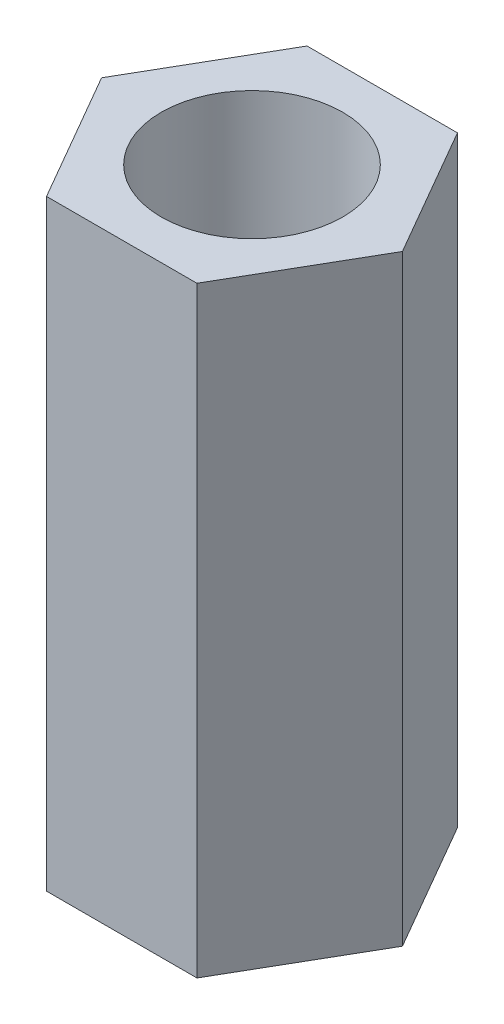
ISO-10303-21;
HEADER;
FILE_DESCRIPTION(('STEP AP214'),'2;1');
FILE_NAME('part.step','',(''),(''),'','','');
FILE_SCHEMA(('AUTOMOTIVE_DESIGN { 1 0 10303 214 1 1 1 1 }'));
ENDSEC;
DATA;
#1=APPLICATION_CONTEXT('core data for automotive mechanical design processes');
#2=APPLICATION_PROTOCOL_DEFINITION('international standard','automotive_design',2000,#1);
#3=PRODUCT_CONTEXT('',#1,'mechanical');
#4=PRODUCT('Part','Part','',(#3));
#5=PRODUCT_RELATED_PRODUCT_CATEGORY('part','',(#4));
#6=PRODUCT_DEFINITION_FORMATION('','',#4);
#7=PRODUCT_DEFINITION_CONTEXT('part definition',#1,'design');
#8=PRODUCT_DEFINITION('design','',#6,#7);
#9=PRODUCT_DEFINITION_SHAPE('','',#8);
#10=(LENGTH_UNIT() NAMED_UNIT(*) SI_UNIT(.MILLI.,.METRE.));
#11=(NAMED_UNIT(*) PLANE_ANGLE_UNIT() SI_UNIT($,.RADIAN.));
#12=(NAMED_UNIT(*) SI_UNIT($,.STERADIAN.) SOLID_ANGLE_UNIT());
#13=UNCERTAINTY_MEASURE_WITH_UNIT(LENGTH_MEASURE(1.E-05),#10,'distance_accuracy_value','');
#14=(GEOMETRIC_REPRESENTATION_CONTEXT(3) GLOBAL_UNCERTAINTY_ASSIGNED_CONTEXT((#13)) GLOBAL_UNIT_ASSIGNED_CONTEXT((#10,
#11,#12)) REPRESENTATION_CONTEXT('',''));
#15=CARTESIAN_POINT('',(0.,0.,0.));
#16=DIRECTION('',(0.,0.,1.));
#17=DIRECTION('',(1.,0.,0.));
#18=AXIS2_PLACEMENT_3D('',#15,#16,#17);
#19=CARTESIAN_POINT('',(-3.625,29.,-6.27868417743718));
#20=DIRECTION('',(0.866025403784439,0.,0.5));
#21=DIRECTION('',(0.5,0.,-0.866025403784439));
#22=AXIS2_PLACEMENT_3D('',#19,#20,#21);
#23=PLANE('',#22);
#24=DIRECTION('',(-0.5,0.,0.866025403784439));
#25=VECTOR('',#24,1.);
#26=CARTESIAN_POINT('',(-3.625,0.,-6.27868417743718));
#27=LINE('',#26,#25);
#28=CARTESIAN_POINT('',(-3.625,0.,-6.27868417743718));
#29=VERTEX_POINT('',#28);
#30=CARTESIAN_POINT('',(-7.25,0.,0.));
#31=VERTEX_POINT('',#30);
#32=EDGE_CURVE('E128',#29,#31,#27,.T.);
#33=ORIENTED_EDGE('',*,*,#32,.T.);
#34=DIRECTION('',(0.,-1.,0.));
#35=VECTOR('',#34,1.);
#36=CARTESIAN_POINT('',(-7.25,29.,0.));
#37=LINE('',#36,#35);
#38=CARTESIAN_POINT('',(-7.25,29.,0.));
#39=VERTEX_POINT('',#38);
#40=EDGE_CURVE('E11',#39,#31,#37,.T.);
#41=ORIENTED_EDGE('',*,*,#40,.F.);
#42=DIRECTION('',(-0.5,0.,0.866025403784439));
#43=VECTOR('',#42,1.);
#44=CARTESIAN_POINT('',(-3.625,29.,-6.27868417743718));
#45=LINE('',#44,#43);
#46=CARTESIAN_POINT('',(-3.625,29.,-6.27868417743718));
#47=VERTEX_POINT('',#46);
#48=EDGE_CURVE('E145',#47,#39,#45,.T.);
#49=ORIENTED_EDGE('',*,*,#48,.F.);
#50=DIRECTION('',(0.,-1.,0.));
#51=VECTOR('',#50,1.);
#52=CARTESIAN_POINT('',(-3.625,29.,-6.27868417743718));
#53=LINE('',#52,#51);
#54=EDGE_CURVE('E124',#47,#29,#53,.T.);
#55=ORIENTED_EDGE('',*,*,#54,.T.);
#56=EDGE_LOOP('',(#33,#41,#49,#55));
#57=FACE_BOUND('',#56,.T.);
#58=ADVANCED_FACE('F39',(#57),#23,.F.);
#59=CARTESIAN_POINT('',(-7.25,29.,0.));
#60=DIRECTION('',(0.866025403784439,0.,-0.5));
#61=DIRECTION('',(-0.5,0.,-0.866025403784439));
#62=AXIS2_PLACEMENT_3D('',#59,#60,#61);
#63=PLANE('',#62);
#64=DIRECTION('',(0.5,0.,0.866025403784439));
#65=VECTOR('',#64,1.);
#66=CARTESIAN_POINT('',(-7.25,0.,0.));
#67=LINE('',#66,#65);
#68=CARTESIAN_POINT('',(-3.625,0.,6.27868417743718));
#69=VERTEX_POINT('',#68);
#70=EDGE_CURVE('E132',#31,#69,#67,.T.);
#71=ORIENTED_EDGE('',*,*,#70,.T.);
#72=DIRECTION('',(0.,-1.,0.));
#73=VECTOR('',#72,1.);
#74=CARTESIAN_POINT('',(-3.625,29.,6.27868417743718));
#75=LINE('',#74,#73);
#76=CARTESIAN_POINT('',(-3.625,29.,6.27868417743718));
#77=VERTEX_POINT('',#76);
#78=EDGE_CURVE('E48',#77,#69,#75,.T.);
#79=ORIENTED_EDGE('',*,*,#78,.F.);
#80=DIRECTION('',(0.5,0.,0.866025403784439));
#81=VECTOR('',#80,1.);
#82=CARTESIAN_POINT('',(-7.25,29.,0.));
#83=LINE('',#82,#81);
#84=EDGE_CURVE('E93',#39,#77,#83,.T.);
#85=ORIENTED_EDGE('',*,*,#84,.F.);
#86=ORIENTED_EDGE('',*,*,#40,.T.);
#87=EDGE_LOOP('',(#71,#79,#85,#86));
#88=FACE_BOUND('',#87,.T.);
#89=ADVANCED_FACE('F174',(#88),#63,.F.);
#90=CARTESIAN_POINT('',(-3.625,29.,6.27868417743718));
#91=DIRECTION('',(0.,0.,-1.));
#92=DIRECTION('',(-1.,0.,0.));
#93=AXIS2_PLACEMENT_3D('',#90,#91,#92);
#94=PLANE('',#93);
#95=DIRECTION('',(1.,0.,0.));
#96=VECTOR('',#95,1.);
#97=CARTESIAN_POINT('',(-3.625,0.,6.27868417743718));
#98=LINE('',#97,#96);
#99=CARTESIAN_POINT('',(3.625,0.,6.27868417743718));
#100=VERTEX_POINT('',#99);
#101=EDGE_CURVE('E136',#69,#100,#98,.T.);
#102=ORIENTED_EDGE('',*,*,#101,.T.);
#103=DIRECTION('',(0.,-1.,0.));
#104=VECTOR('',#103,1.);
#105=CARTESIAN_POINT('',(3.625,29.,6.27868417743718));
#106=LINE('',#105,#104);
#107=CARTESIAN_POINT('',(3.625,29.,6.27868417743718));
#108=VERTEX_POINT('',#107);
#109=EDGE_CURVE('E117',#108,#100,#106,.T.);
#110=ORIENTED_EDGE('',*,*,#109,.F.);
#111=DIRECTION('',(1.,0.,0.));
#112=VECTOR('',#111,1.);
#113=CARTESIAN_POINT('',(-3.625,29.,6.27868417743718));
#114=LINE('',#113,#112);
#115=EDGE_CURVE('E106',#77,#108,#114,.T.);
#116=ORIENTED_EDGE('',*,*,#115,.F.);
#117=ORIENTED_EDGE('',*,*,#78,.T.);
#118=EDGE_LOOP('',(#102,#110,#116,#117));
#119=FACE_BOUND('',#118,.T.);
#120=ADVANCED_FACE('F155',(#119),#94,.F.);
#121=CARTESIAN_POINT('',(3.625,29.,6.27868417743718));
#122=DIRECTION('',(-0.866025403784439,0.,-0.5));
#123=DIRECTION('',(-0.5,0.,0.866025403784439));
#124=AXIS2_PLACEMENT_3D('',#121,#122,#123);
#125=PLANE('',#124);
#126=DIRECTION('',(0.5,0.,-0.866025403784439));
#127=VECTOR('',#126,1.);
#128=CARTESIAN_POINT('',(3.625,0.,6.27868417743718));
#129=LINE('',#128,#127);
#130=CARTESIAN_POINT('',(7.25,0.,0.));
#131=VERTEX_POINT('',#130);
#132=EDGE_CURVE('E115',#100,#131,#129,.T.);
#133=ORIENTED_EDGE('',*,*,#132,.T.);
#134=DIRECTION('',(0.,-1.,0.));
#135=VECTOR('',#134,1.);
#136=CARTESIAN_POINT('',(7.25,29.,0.));
#137=LINE('',#136,#135);
#138=CARTESIAN_POINT('',(7.25,29.,0.));
#139=VERTEX_POINT('',#138);
#140=EDGE_CURVE('E112',#139,#131,#137,.T.);
#141=ORIENTED_EDGE('',*,*,#140,.F.);
#142=DIRECTION('',(0.5,0.,-0.866025403784439));
#143=VECTOR('',#142,1.);
#144=CARTESIAN_POINT('',(3.625,29.,6.27868417743718));
#145=LINE('',#144,#143);
#146=EDGE_CURVE('E100',#108,#139,#145,.T.);
#147=ORIENTED_EDGE('',*,*,#146,.F.);
#148=ORIENTED_EDGE('',*,*,#109,.T.);
#149=EDGE_LOOP('',(#133,#141,#147,#148));
#150=FACE_BOUND('',#149,.T.);
#151=ADVANCED_FACE('F113',(#150),#125,.F.);
#152=CARTESIAN_POINT('',(7.25,29.,0.));
#153=DIRECTION('',(-0.866025403784438,0.,0.500000000000001));
#154=DIRECTION('',(0.500000000000001,0.,0.866025403784438));
#155=AXIS2_PLACEMENT_3D('',#152,#153,#154);
#156=PLANE('',#155);
#157=DIRECTION('',(-0.500000000000001,0.,-0.866025403784438));
#158=VECTOR('',#157,1.);
#159=CARTESIAN_POINT('',(7.25,0.,0.));
#160=LINE('',#159,#158);
#161=CARTESIAN_POINT('',(3.62499999999999,0.,-6.27868417743718));
#162=VERTEX_POINT('',#161);
#163=EDGE_CURVE('E79',#131,#162,#160,.T.);
#164=ORIENTED_EDGE('',*,*,#163,.T.);
#165=DIRECTION('',(0.,-1.,0.));
#166=VECTOR('',#165,1.);
#167=CARTESIAN_POINT('',(3.62499999999999,29.,-6.27868417743718));
#168=LINE('',#167,#166);
#169=CARTESIAN_POINT('',(3.62499999999999,29.,-6.27868417743718));
#170=VERTEX_POINT('',#169);
#171=EDGE_CURVE('E118',#170,#162,#168,.T.);
#172=ORIENTED_EDGE('',*,*,#171,.F.);
#173=DIRECTION('',(-0.500000000000001,0.,-0.866025403784438));
#174=VECTOR('',#173,1.);
#175=CARTESIAN_POINT('',(7.25,29.,0.));
#176=LINE('',#175,#174);
#177=EDGE_CURVE('E104',#139,#170,#176,.T.);
#178=ORIENTED_EDGE('',*,*,#177,.F.);
#179=ORIENTED_EDGE('',*,*,#140,.T.);
#180=EDGE_LOOP('',(#164,#172,#178,#179));
#181=FACE_BOUND('',#180,.T.);
#182=ADVANCED_FACE('F120',(#181),#156,.F.);
#183=CARTESIAN_POINT('',(3.62499999999999,29.,-6.27868417743718));
#184=DIRECTION('',(0.,0.,1.));
#185=DIRECTION('',(1.,0.,0.));
#186=AXIS2_PLACEMENT_3D('',#183,#184,#185);
#187=PLANE('',#186);
#188=DIRECTION('',(-1.,0.,0.));
#189=VECTOR('',#188,1.);
#190=CARTESIAN_POINT('',(3.62499999999999,0.,-6.27868417743718));
#191=LINE('',#190,#189);
#192=EDGE_CURVE('E85',#162,#29,#191,.T.);
#193=ORIENTED_EDGE('',*,*,#192,.T.);
#194=ORIENTED_EDGE('',*,*,#54,.F.);
#195=DIRECTION('',(-1.,0.,0.));
#196=VECTOR('',#195,1.);
#197=CARTESIAN_POINT('',(3.62499999999999,29.,-6.27868417743718));
#198=LINE('',#197,#196);
#199=EDGE_CURVE('E56',#170,#47,#198,.T.);
#200=ORIENTED_EDGE('',*,*,#199,.F.);
#201=ORIENTED_EDGE('',*,*,#171,.T.);
#202=EDGE_LOOP('',(#193,#194,#200,#201));
#203=FACE_BOUND('',#202,.T.);
#204=ADVANCED_FACE('F162',(#203),#187,.F.);
#205=CARTESIAN_POINT('',(0.,29.,0.));
#206=DIRECTION('',(0.,1.,0.));
#207=DIRECTION('',(0.,0.,1.));
#208=AXIS2_PLACEMENT_3D('',#205,#206,#207);
#209=PLANE('',#208);
#210=CARTESIAN_POINT('',(0.,29.,0.));
#211=DIRECTION('',(0.,-1.,0.));
#212=DIRECTION('',(0.,0.,-1.));
#213=AXIS2_PLACEMENT_3D('',#210,#211,#212);
#214=CIRCLE('',#213,4.375);
#215=CARTESIAN_POINT('',(0.,29.,-4.375));
#216=VERTEX_POINT('',#215);
#217=EDGE_CURVE('E133',#216,#216,#214,.T.);
#218=ORIENTED_EDGE('',*,*,#217,.T.);
#219=EDGE_LOOP('',(#218));
#220=FACE_BOUND('',#219,.T.);
#221=ORIENTED_EDGE('',*,*,#48,.T.);
#222=ORIENTED_EDGE('',*,*,#84,.T.);
#223=ORIENTED_EDGE('',*,*,#115,.T.);
#224=ORIENTED_EDGE('',*,*,#146,.T.);
#225=ORIENTED_EDGE('',*,*,#177,.T.);
#226=ORIENTED_EDGE('',*,*,#199,.T.);
#227=EDGE_LOOP('',(#221,#222,#223,#224,#225,#226));
#228=FACE_BOUND('',#227,.T.);
#229=ADVANCED_FACE('F102',(#220,#228),#209,.T.);
#230=CARTESIAN_POINT('',(0.,0.,0.));
#231=DIRECTION('',(0.,1.,0.));
#232=DIRECTION('',(0.,0.,1.));
#233=AXIS2_PLACEMENT_3D('',#230,#231,#232);
#234=PLANE('',#233);
#235=CARTESIAN_POINT('',(0.,0.,0.));
#236=DIRECTION('',(0.,-1.,0.));
#237=DIRECTION('',(0.,0.,-1.));
#238=AXIS2_PLACEMENT_3D('',#235,#236,#237);
#239=CIRCLE('',#238,4.375);
#240=CARTESIAN_POINT('',(0.,0.,-4.375));
#241=VERTEX_POINT('',#240);
#242=EDGE_CURVE('E229',#241,#241,#239,.T.);
#243=ORIENTED_EDGE('',*,*,#242,.F.);
#244=EDGE_LOOP('',(#243));
#245=FACE_BOUND('',#244,.T.);
#246=ORIENTED_EDGE('',*,*,#32,.F.);
#247=ORIENTED_EDGE('',*,*,#192,.F.);
#248=ORIENTED_EDGE('',*,*,#163,.F.);
#249=ORIENTED_EDGE('',*,*,#132,.F.);
#250=ORIENTED_EDGE('',*,*,#101,.F.);
#251=ORIENTED_EDGE('',*,*,#70,.F.);
#252=EDGE_LOOP('',(#246,#247,#248,#249,#250,#251));
#253=FACE_BOUND('',#252,.T.);
#254=ADVANCED_FACE('F158',(#245,#253),#234,.F.);
#255=CARTESIAN_POINT('',(0.,29.,0.));
#256=DIRECTION('',(0.,-1.,0.));
#257=DIRECTION('',(0.,0.,-1.));
#258=AXIS2_PLACEMENT_3D('',#255,#256,#257);
#259=CYLINDRICAL_SURFACE('',#258,4.375);
#260=CARTESIAN_POINT('',(0.,29.,-4.375));
#261=CARTESIAN_POINT('',(0.,28.6979166666667,-4.375));
#262=CARTESIAN_POINT('',(0.,28.3958333333333,-4.375));
#263=CARTESIAN_POINT('',(0.,27.7916666666667,-4.375));
#264=CARTESIAN_POINT('',(0.,27.4895833333333,-4.375));
#265=CARTESIAN_POINT('',(0.,26.8854166666667,-4.375));
#266=CARTESIAN_POINT('',(0.,26.5833333333333,-4.375));
#267=CARTESIAN_POINT('',(0.,25.9791666666667,-4.375));
#268=CARTESIAN_POINT('',(0.,25.6770833333333,-4.375));
#269=CARTESIAN_POINT('',(0.,25.0729166666667,-4.375));
#270=CARTESIAN_POINT('',(0.,24.7708333333333,-4.375));
#271=CARTESIAN_POINT('',(0.,24.1666666666667,-4.375));
#272=CARTESIAN_POINT('',(0.,23.8645833333333,-4.375));
#273=CARTESIAN_POINT('',(0.,23.2604166666667,-4.375));
#274=CARTESIAN_POINT('',(0.,22.9583333333333,-4.375));
#275=CARTESIAN_POINT('',(0.,22.3541666666667,-4.375));
#276=CARTESIAN_POINT('',(0.,22.0520833333333,-4.375));
#277=CARTESIAN_POINT('',(0.,21.4479166666667,-4.375));
#278=CARTESIAN_POINT('',(0.,21.1458333333333,-4.375));
#279=CARTESIAN_POINT('',(0.,20.5416666666667,-4.375));
#280=CARTESIAN_POINT('',(0.,20.2395833333333,-4.375));
#281=CARTESIAN_POINT('',(0.,19.6354166666667,-4.375));
#282=CARTESIAN_POINT('',(0.,19.3333333333333,-4.375));
#283=CARTESIAN_POINT('',(0.,18.7291666666667,-4.375));
#284=CARTESIAN_POINT('',(0.,18.4270833333333,-4.375));
#285=CARTESIAN_POINT('',(0.,17.8229166666667,-4.375));
#286=CARTESIAN_POINT('',(0.,17.5208333333333,-4.375));
#287=CARTESIAN_POINT('',(0.,16.9166666666667,-4.375));
#288=CARTESIAN_POINT('',(0.,16.6145833333333,-4.375));
#289=CARTESIAN_POINT('',(0.,16.0104166666667,-4.375));
#290=CARTESIAN_POINT('',(0.,15.7083333333333,-4.375));
#291=CARTESIAN_POINT('',(0.,15.1041666666667,-4.375));
#292=CARTESIAN_POINT('',(0.,14.8020833333333,-4.375));
#293=CARTESIAN_POINT('',(0.,14.1979166666667,-4.375));
#294=CARTESIAN_POINT('',(0.,13.8958333333333,-4.375));
#295=CARTESIAN_POINT('',(0.,13.2916666666667,-4.375));
#296=CARTESIAN_POINT('',(0.,12.9895833333333,-4.375));
#297=CARTESIAN_POINT('',(0.,12.3854166666667,-4.375));
#298=CARTESIAN_POINT('',(0.,12.0833333333333,-4.375));
#299=CARTESIAN_POINT('',(0.,11.4791666666667,-4.375));
#300=CARTESIAN_POINT('',(0.,11.1770833333333,-4.375));
#301=CARTESIAN_POINT('',(0.,10.5729166666667,-4.375));
#302=CARTESIAN_POINT('',(0.,10.2708333333333,-4.375));
#303=CARTESIAN_POINT('',(0.,9.66666666666667,-4.375));
#304=CARTESIAN_POINT('',(0.,9.36458333333333,-4.375));
#305=CARTESIAN_POINT('',(0.,8.76041666666667,-4.375));
#306=CARTESIAN_POINT('',(0.,8.45833333333333,-4.375));
#307=CARTESIAN_POINT('',(0.,7.85416666666667,-4.375));
#308=CARTESIAN_POINT('',(0.,7.55208333333333,-4.375));
#309=CARTESIAN_POINT('',(0.,6.94791666666667,-4.375));
#310=CARTESIAN_POINT('',(0.,6.64583333333333,-4.375));
#311=CARTESIAN_POINT('',(0.,6.04166666666667,-4.375));
#312=CARTESIAN_POINT('',(0.,5.73958333333333,-4.375));
#313=CARTESIAN_POINT('',(0.,5.13541666666667,-4.375));
#314=CARTESIAN_POINT('',(0.,4.83333333333333,-4.375));
#315=CARTESIAN_POINT('',(0.,4.22916666666667,-4.375));
#316=CARTESIAN_POINT('',(0.,3.92708333333333,-4.375));
#317=CARTESIAN_POINT('',(0.,3.32291666666667,-4.375));
#318=CARTESIAN_POINT('',(0.,3.02083333333333,-4.375));
#319=CARTESIAN_POINT('',(0.,2.41666666666667,-4.375));
#320=CARTESIAN_POINT('',(0.,2.11458333333333,-4.375));
#321=CARTESIAN_POINT('',(0.,1.51041666666667,-4.375));
#322=CARTESIAN_POINT('',(0.,1.20833333333333,-4.375));
#323=CARTESIAN_POINT('',(0.,0.604166666666667,-4.375));
#324=CARTESIAN_POINT('',(0.,0.302083333333333,-4.375));
#325=CARTESIAN_POINT('',(0.,0.,-4.375));
#326=B_SPLINE_CURVE_WITH_KNOTS('',3,(#260,#261,#262,#263,#264,#265,#266,#267,#268,#269,#270,
#271,#272,#273,#274,#275,#276,#277,#278,#279,#280,#281,#282,#283,#284,#285,#286,#287,#288,#289,
#290,#291,#292,#293,#294,#295,#296,#297,#298,#299,#300,#301,#302,#303,#304,#305,#306,#307,#308,
#309,#310,#311,#312,#313,#314,#315,#316,#317,#318,#319,#320,#321,#322,#323,#324,#325),
.UNSPECIFIED.,.F.,.F.,(4,2,2,2,2,2,2,2,2,2,2,2,2,2,2,2,2,2,2,2,2,2,2,2,2,2,2,2,2,2,2,2,4),(0.,
0.906249999999997,1.8125,2.71875,3.625,4.53125,5.4375,6.34375,7.25,8.15625,9.0625,9.96875,
10.875,11.78125,12.6875,13.59375,14.5,15.40625,16.3125,17.21875,18.125,19.03125,19.9375,
20.84375,21.75,22.65625,23.5625,24.46875,25.375,26.28125,27.1875,28.09375,29.),.UNSPECIFIED.);
#327=EDGE_CURVE('BSEAM211',#216,#241,#326,.T.);
#328=ORIENTED_EDGE('',*,*,#217,.F.);
#329=ORIENTED_EDGE('',*,*,#242,.T.);
#330=ORIENTED_EDGE('',*,*,#327,.T.);
#331=ORIENTED_EDGE('',*,*,#327,.F.);
#332=EDGE_LOOP('',(#328,#330,#329,#331));
#333=FACE_BOUND('',#332,.T.);
#334=ADVANCED_FACE('F211',(#333),#259,.F.);
#335=CLOSED_SHELL('',(#58,#89,#120,#151,#182,#204,#229,#254,#334));
#336=MANIFOLD_SOLID_BREP('B2',#335);
#337=ADVANCED_BREP_SHAPE_REPRESENTATION('',(#18,#336),#14);
#338=SHAPE_DEFINITION_REPRESENTATION(#9,#337);
ENDSEC;
END-ISO-10303-21;
